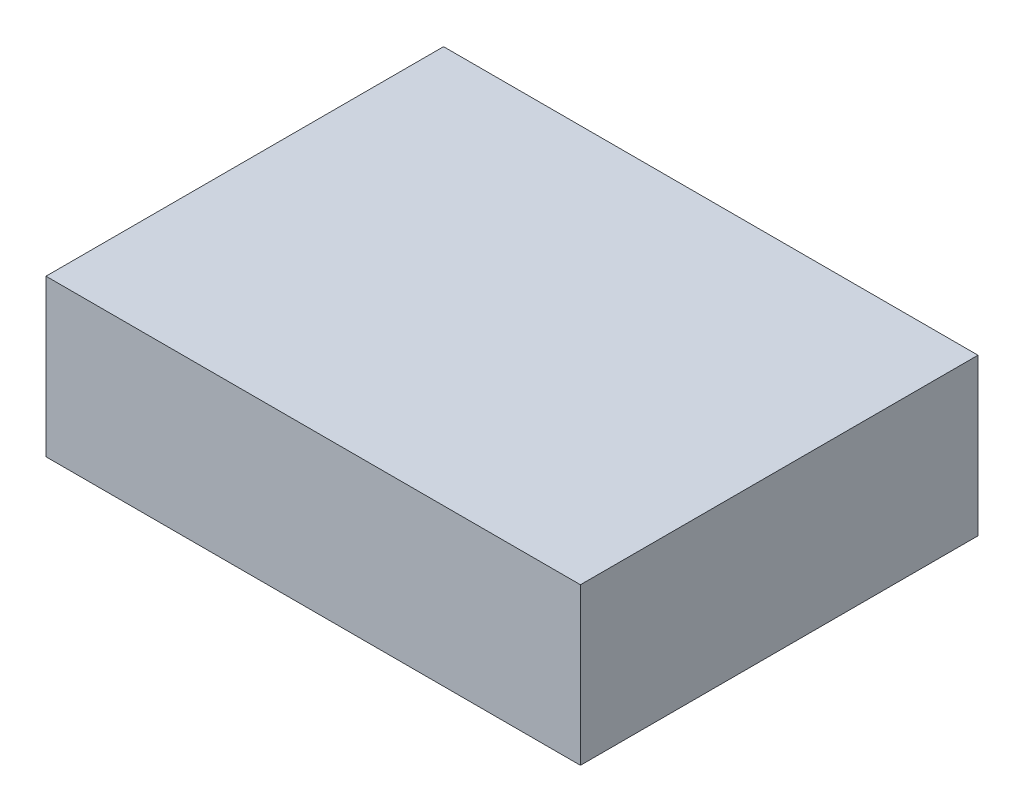
ISO-10303-21;
HEADER;
FILE_DESCRIPTION(('STEP AP214'),'2;1');
FILE_NAME('part.step','',(''),(''),'','','');
FILE_SCHEMA(('AUTOMOTIVE_DESIGN { 1 0 10303 214 1 1 1 1 }'));
ENDSEC;
DATA;
#1=APPLICATION_CONTEXT('core data for automotive mechanical design processes');
#2=APPLICATION_PROTOCOL_DEFINITION('international standard','automotive_design',2000,#1);
#3=PRODUCT_CONTEXT('',#1,'mechanical');
#4=PRODUCT('Part','Part','',(#3));
#5=PRODUCT_RELATED_PRODUCT_CATEGORY('part','',(#4));
#6=PRODUCT_DEFINITION_FORMATION('','',#4);
#7=PRODUCT_DEFINITION_CONTEXT('part definition',#1,'design');
#8=PRODUCT_DEFINITION('design','',#6,#7);
#9=PRODUCT_DEFINITION_SHAPE('','',#8);
#10=(LENGTH_UNIT() NAMED_UNIT(*) SI_UNIT(.MILLI.,.METRE.));
#11=(NAMED_UNIT(*) PLANE_ANGLE_UNIT() SI_UNIT($,.RADIAN.));
#12=(NAMED_UNIT(*) SI_UNIT($,.STERADIAN.) SOLID_ANGLE_UNIT());
#13=UNCERTAINTY_MEASURE_WITH_UNIT(LENGTH_MEASURE(1.E-05),#10,'distance_accuracy_value','');
#14=(GEOMETRIC_REPRESENTATION_CONTEXT(3) GLOBAL_UNCERTAINTY_ASSIGNED_CONTEXT((#13)) GLOBAL_UNIT_ASSIGNED_CONTEXT((#10,
#11,#12)) REPRESENTATION_CONTEXT('',''));
#15=CARTESIAN_POINT('',(0.,0.,0.));
#16=DIRECTION('',(0.,0.,1.));
#17=DIRECTION('',(1.,0.,0.));
#18=AXIS2_PLACEMENT_3D('',#15,#16,#17);
#19=CARTESIAN_POINT('',(130.175,76.2,-96.8375));
#20=DIRECTION('',(-1.,0.,0.));
#21=DIRECTION('',(0.,0.,1.));
#22=AXIS2_PLACEMENT_3D('',#19,#20,#21);
#23=PLANE('',#22);
#24=DIRECTION('',(0.,0.,-1.));
#25=VECTOR('',#24,1.);
#26=CARTESIAN_POINT('',(130.175,0.,-96.8375));
#27=LINE('',#26,#25);
#28=CARTESIAN_POINT('',(130.175,0.,96.8375));
#29=VERTEX_POINT('',#28);
#30=CARTESIAN_POINT('',(130.175,0.,-96.8375));
#31=VERTEX_POINT('',#30);
#32=EDGE_CURVE('E100',#29,#31,#27,.T.);
#33=ORIENTED_EDGE('',*,*,#32,.T.);
#34=DIRECTION('',(0.,-1.,0.));
#35=VECTOR('',#34,1.);
#36=CARTESIAN_POINT('',(130.175,76.2,-96.8375));
#37=LINE('',#36,#35);
#38=CARTESIAN_POINT('',(130.175,76.2,-96.8375));
#39=VERTEX_POINT('',#38);
#40=EDGE_CURVE('E11',#39,#31,#37,.T.);
#41=ORIENTED_EDGE('',*,*,#40,.F.);
#42=DIRECTION('',(0.,0.,-1.));
#43=VECTOR('',#42,1.);
#44=CARTESIAN_POINT('',(130.175,76.2,-96.8375));
#45=LINE('',#44,#43);
#46=CARTESIAN_POINT('',(130.175,76.2,96.8375));
#47=VERTEX_POINT('',#46);
#48=EDGE_CURVE('E88',#47,#39,#45,.T.);
#49=ORIENTED_EDGE('',*,*,#48,.F.);
#50=DIRECTION('',(0.,-1.,0.));
#51=VECTOR('',#50,1.);
#52=CARTESIAN_POINT('',(130.175,76.2,96.8375));
#53=LINE('',#52,#51);
#54=EDGE_CURVE('E96',#47,#29,#53,.T.);
#55=ORIENTED_EDGE('',*,*,#54,.T.);
#56=EDGE_LOOP('',(#33,#41,#49,#55));
#57=FACE_BOUND('',#56,.T.);
#58=ADVANCED_FACE('F37',(#57),#23,.F.);
#59=CARTESIAN_POINT('',(-130.175,76.2,-96.8375));
#60=DIRECTION('',(0.,0.,1.));
#61=DIRECTION('',(1.,0.,0.));
#62=AXIS2_PLACEMENT_3D('',#59,#60,#61);
#63=PLANE('',#62);
#64=DIRECTION('',(-1.,0.,0.));
#65=VECTOR('',#64,1.);
#66=CARTESIAN_POINT('',(-130.175,0.,-96.8375));
#67=LINE('',#66,#65);
#68=CARTESIAN_POINT('',(-130.175,0.,-96.8375));
#69=VERTEX_POINT('',#68);
#70=EDGE_CURVE('E92',#31,#69,#67,.T.);
#71=ORIENTED_EDGE('',*,*,#70,.T.);
#72=DIRECTION('',(0.,-1.,0.));
#73=VECTOR('',#72,1.);
#74=CARTESIAN_POINT('',(-130.175,76.2,-96.8375));
#75=LINE('',#74,#73);
#76=CARTESIAN_POINT('',(-130.175,76.2,-96.8375));
#77=VERTEX_POINT('',#76);
#78=EDGE_CURVE('E45',#77,#69,#75,.T.);
#79=ORIENTED_EDGE('',*,*,#78,.F.);
#80=DIRECTION('',(-1.,0.,0.));
#81=VECTOR('',#80,1.);
#82=CARTESIAN_POINT('',(-130.175,76.2,-96.8375));
#83=LINE('',#82,#81);
#84=EDGE_CURVE('E83',#39,#77,#83,.T.);
#85=ORIENTED_EDGE('',*,*,#84,.F.);
#86=ORIENTED_EDGE('',*,*,#40,.T.);
#87=EDGE_LOOP('',(#71,#79,#85,#86));
#88=FACE_BOUND('',#87,.T.);
#89=ADVANCED_FACE('F91',(#88),#63,.F.);
#90=CARTESIAN_POINT('',(-130.175,76.2,-96.8375));
#91=DIRECTION('',(1.,0.,0.));
#92=DIRECTION('',(0.,0.,-1.));
#93=AXIS2_PLACEMENT_3D('',#90,#91,#92);
#94=PLANE('',#93);
#95=DIRECTION('',(0.,0.,1.));
#96=VECTOR('',#95,1.);
#97=CARTESIAN_POINT('',(-130.175,0.,-96.8375));
#98=LINE('',#97,#96);
#99=CARTESIAN_POINT('',(-130.175,0.,96.8375));
#100=VERTEX_POINT('',#99);
#101=EDGE_CURVE('E70',#69,#100,#98,.T.);
#102=ORIENTED_EDGE('',*,*,#101,.T.);
#103=DIRECTION('',(0.,-1.,0.));
#104=VECTOR('',#103,1.);
#105=CARTESIAN_POINT('',(-130.175,76.2,96.8375));
#106=LINE('',#105,#104);
#107=CARTESIAN_POINT('',(-130.175,76.2,96.8375));
#108=VERTEX_POINT('',#107);
#109=EDGE_CURVE('E93',#108,#100,#106,.T.);
#110=ORIENTED_EDGE('',*,*,#109,.F.);
#111=DIRECTION('',(0.,0.,1.));
#112=VECTOR('',#111,1.);
#113=CARTESIAN_POINT('',(-130.175,76.2,-96.8375));
#114=LINE('',#113,#112);
#115=EDGE_CURVE('E86',#77,#108,#114,.T.);
#116=ORIENTED_EDGE('',*,*,#115,.F.);
#117=ORIENTED_EDGE('',*,*,#78,.T.);
#118=EDGE_LOOP('',(#102,#110,#116,#117));
#119=FACE_BOUND('',#118,.T.);
#120=ADVANCED_FACE('F94',(#119),#94,.F.);
#121=CARTESIAN_POINT('',(-130.175,76.2,96.8375));
#122=DIRECTION('',(0.,0.,-1.));
#123=DIRECTION('',(-1.,0.,0.));
#124=AXIS2_PLACEMENT_3D('',#121,#122,#123);
#125=PLANE('',#124);
#126=DIRECTION('',(1.,0.,0.));
#127=VECTOR('',#126,1.);
#128=CARTESIAN_POINT('',(-130.175,0.,96.8375));
#129=LINE('',#128,#127);
#130=EDGE_CURVE('E76',#100,#29,#129,.T.);
#131=ORIENTED_EDGE('',*,*,#130,.T.);
#132=ORIENTED_EDGE('',*,*,#54,.F.);
#133=DIRECTION('',(1.,0.,0.));
#134=VECTOR('',#133,1.);
#135=CARTESIAN_POINT('',(-130.175,76.2,96.8375));
#136=LINE('',#135,#134);
#137=EDGE_CURVE('E53',#108,#47,#136,.T.);
#138=ORIENTED_EDGE('',*,*,#137,.F.);
#139=ORIENTED_EDGE('',*,*,#109,.T.);
#140=EDGE_LOOP('',(#131,#132,#138,#139));
#141=FACE_BOUND('',#140,.T.);
#142=ADVANCED_FACE('F107',(#141),#125,.F.);
#143=CARTESIAN_POINT('',(0.,76.2,0.));
#144=DIRECTION('',(0.,1.,0.));
#145=DIRECTION('',(0.,0.,1.));
#146=AXIS2_PLACEMENT_3D('',#143,#144,#145);
#147=PLANE('',#146);
#148=ORIENTED_EDGE('',*,*,#48,.T.);
#149=ORIENTED_EDGE('',*,*,#84,.T.);
#150=ORIENTED_EDGE('',*,*,#115,.T.);
#151=ORIENTED_EDGE('',*,*,#137,.T.);
#152=EDGE_LOOP('',(#148,#149,#150,#151));
#153=FACE_BOUND('',#152,.T.);
#154=ADVANCED_FACE('F84',(#153),#147,.T.);
#155=CARTESIAN_POINT('',(0.,0.,0.));
#156=DIRECTION('',(0.,1.,0.));
#157=DIRECTION('',(0.,0.,1.));
#158=AXIS2_PLACEMENT_3D('',#155,#156,#157);
#159=PLANE('',#158);
#160=ORIENTED_EDGE('',*,*,#32,.F.);
#161=ORIENTED_EDGE('',*,*,#130,.F.);
#162=ORIENTED_EDGE('',*,*,#101,.F.);
#163=ORIENTED_EDGE('',*,*,#70,.F.);
#164=EDGE_LOOP('',(#160,#161,#162,#163));
#165=FACE_BOUND('',#164,.T.);
#166=ADVANCED_FACE('F110',(#165),#159,.F.);
#167=CLOSED_SHELL('',(#58,#89,#120,#142,#154,#166));
#168=MANIFOLD_SOLID_BREP('B2',#167);
#169=ADVANCED_BREP_SHAPE_REPRESENTATION('',(#18,#168),#14);
#170=SHAPE_DEFINITION_REPRESENTATION(#9,#169);
ENDSEC;
END-ISO-10303-21;
